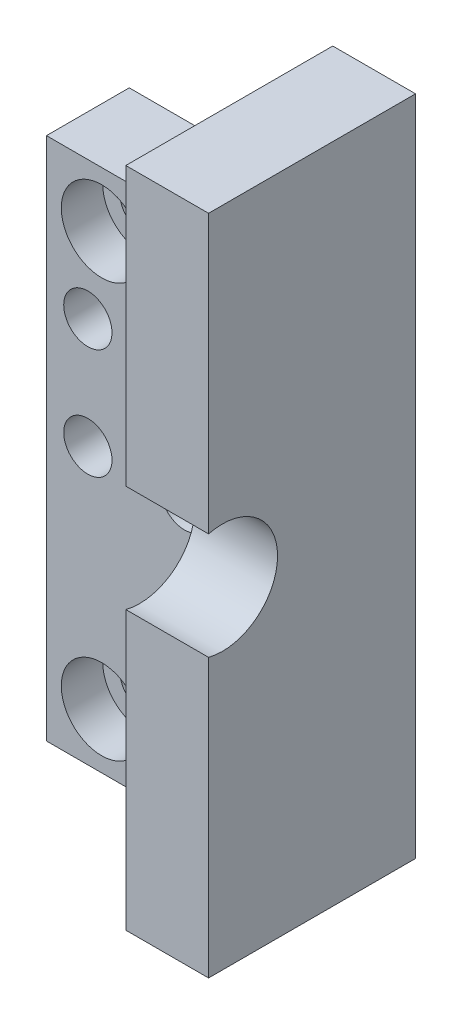
ISO-10303-21;
HEADER;
FILE_DESCRIPTION(('STEP AP214'),'2;1');
FILE_NAME('part.step','',(''),(''),'','','');
FILE_SCHEMA(('AUTOMOTIVE_DESIGN { 1 0 10303 214 1 1 1 1 }'));
ENDSEC;
DATA;
#1=APPLICATION_CONTEXT('core data for automotive mechanical design processes');
#2=APPLICATION_PROTOCOL_DEFINITION('international standard','automotive_design',2000,#1);
#3=PRODUCT_CONTEXT('',#1,'mechanical');
#4=PRODUCT('Part','Part','',(#3));
#5=PRODUCT_RELATED_PRODUCT_CATEGORY('part','',(#4));
#6=PRODUCT_DEFINITION_FORMATION('','',#4);
#7=PRODUCT_DEFINITION_CONTEXT('part definition',#1,'design');
#8=PRODUCT_DEFINITION('design','',#6,#7);
#9=PRODUCT_DEFINITION_SHAPE('','',#8);
#10=(LENGTH_UNIT() NAMED_UNIT(*) SI_UNIT(.MILLI.,.METRE.));
#11=(NAMED_UNIT(*) PLANE_ANGLE_UNIT() SI_UNIT($,.RADIAN.));
#12=(NAMED_UNIT(*) SI_UNIT($,.STERADIAN.) SOLID_ANGLE_UNIT());
#13=UNCERTAINTY_MEASURE_WITH_UNIT(LENGTH_MEASURE(1.E-05),#10,'distance_accuracy_value','');
#14=(GEOMETRIC_REPRESENTATION_CONTEXT(3) GLOBAL_UNCERTAINTY_ASSIGNED_CONTEXT((#13)) GLOBAL_UNIT_ASSIGNED_CONTEXT((#10,
#11,#12)) REPRESENTATION_CONTEXT('',''));
#15=CARTESIAN_POINT('',(0.,0.,0.));
#16=DIRECTION('',(0.,0.,1.));
#17=DIRECTION('',(1.,0.,0.));
#18=AXIS2_PLACEMENT_3D('',#15,#16,#17);
#19=CARTESIAN_POINT('',(0.,0.,0.));
#20=DIRECTION('',(0.,0.,-1.));
#21=DIRECTION('',(-1.,0.,0.));
#22=AXIS2_PLACEMENT_3D('',#19,#20,#21);
#23=PLANE('',#22);
#24=DIRECTION('',(0.,-1.,0.));
#25=VECTOR('',#24,1.);
#26=CARTESIAN_POINT('',(20.75,48.,0.));
#27=LINE('',#26,#25);
#28=CARTESIAN_POINT('',(20.75,38.,0.));
#29=VERTEX_POINT('',#28);
#30=CARTESIAN_POINT('',(20.75,0.,0.));
#31=VERTEX_POINT('',#30);
#32=EDGE_CURVE('E149',#29,#31,#27,.T.);
#33=ORIENTED_EDGE('',*,*,#32,.F.);
#34=DIRECTION('',(-1.,0.,0.));
#35=VECTOR('',#34,1.);
#36=CARTESIAN_POINT('',(0.,38.,0.));
#37=LINE('',#36,#35);
#38=CARTESIAN_POINT('',(35.5,38.,0.));
#39=VERTEX_POINT('',#38);
#40=EDGE_CURVE('E168',#39,#29,#37,.T.);
#41=ORIENTED_EDGE('',*,*,#40,.F.);
#42=DIRECTION('',(0.,1.,0.));
#43=VECTOR('',#42,1.);
#44=CARTESIAN_POINT('',(35.5,0.,0.));
#45=LINE('',#44,#43);
#46=CARTESIAN_POINT('',(35.5,48.,0.));
#47=VERTEX_POINT('',#46);
#48=EDGE_CURVE('E328',#39,#47,#45,.T.);
#49=ORIENTED_EDGE('',*,*,#48,.T.);
#50=DIRECTION('',(1.,0.,0.));
#51=VECTOR('',#50,1.);
#52=CARTESIAN_POINT('',(41.5,48.,0.));
#53=LINE('',#52,#51);
#54=CARTESIAN_POINT('',(41.5,48.,0.));
#55=VERTEX_POINT('',#54);
#56=EDGE_CURVE('E296',#47,#55,#53,.T.);
#57=ORIENTED_EDGE('',*,*,#56,.T.);
#58=DIRECTION('',(0.,-1.,0.));
#59=VECTOR('',#58,1.);
#60=CARTESIAN_POINT('',(41.5,0.,0.));
#61=LINE('',#60,#59);
#62=CARTESIAN_POINT('',(41.5,0.,0.));
#63=VERTEX_POINT('',#62);
#64=EDGE_CURVE('E167',#55,#63,#61,.T.);
#65=ORIENTED_EDGE('',*,*,#64,.T.);
#66=DIRECTION('',(1.,0.,0.));
#67=VECTOR('',#66,1.);
#68=CARTESIAN_POINT('',(0.,0.,0.));
#69=LINE('',#68,#67);
#70=EDGE_CURVE('E159',#31,#63,#69,.T.);
#71=ORIENTED_EDGE('',*,*,#70,.F.);
#72=EDGE_LOOP('',(#33,#41,#49,#57,#65,#71));
#73=FACE_BOUND('',#72,.T.);
#74=CARTESIAN_POINT('',(24.75,4.,0.));
#75=DIRECTION('',(0.,0.,-1.));
#76=DIRECTION('',(-1.,0.,0.));
#77=AXIS2_PLACEMENT_3D('',#74,#75,#76);
#78=CIRCLE('',#77,1.675);
#79=CARTESIAN_POINT('',(23.075,4.,0.));
#80=VERTEX_POINT('',#79);
#81=EDGE_CURVE('E289',#80,#80,#78,.T.);
#82=ORIENTED_EDGE('',*,*,#81,.F.);
#83=EDGE_LOOP('',(#82));
#84=FACE_BOUND('',#83,.T.);
#85=CARTESIAN_POINT('',(24.75,34.,0.));
#86=DIRECTION('',(0.,0.,-1.));
#87=DIRECTION('',(-1.,0.,0.));
#88=AXIS2_PLACEMENT_3D('',#85,#86,#87);
#89=CIRCLE('',#88,1.67500000000001);
#90=CARTESIAN_POINT('',(23.075,34.,0.));
#91=VERTEX_POINT('',#90);
#92=EDGE_CURVE('E292',#91,#91,#89,.T.);
#93=ORIENTED_EDGE('',*,*,#92,.F.);
#94=EDGE_LOOP('',(#93));
#95=FACE_BOUND('',#94,.T.);
#96=CARTESIAN_POINT('',(30.75,28.,0.));
#97=DIRECTION('',(0.,0.,-1.));
#98=DIRECTION('',(-1.,0.,0.));
#99=AXIS2_PLACEMENT_3D('',#96,#97,#98);
#100=CIRCLE('',#99,1.75);
#101=CARTESIAN_POINT('',(32.5,28.,0.));
#102=VERTEX_POINT('',#101);
#103=CARTESIAN_POINT('',(29.,28.,0.));
#104=VERTEX_POINT('',#103);
#105=EDGE_CURVE('E186',#102,#104,#100,.F.);
#106=ORIENTED_EDGE('',*,*,#105,.T.);
#107=DIRECTION('',(0.,-1.,0.));
#108=VECTOR('',#107,1.);
#109=CARTESIAN_POINT('',(29.,20.,0.));
#110=LINE('',#109,#108);
#111=CARTESIAN_POINT('',(29.,20.,0.));
#112=VERTEX_POINT('',#111);
#113=EDGE_CURVE('E333',#104,#112,#110,.T.);
#114=ORIENTED_EDGE('',*,*,#113,.T.);
#115=CARTESIAN_POINT('',(30.75,20.,0.));
#116=DIRECTION('',(0.,0.,-1.));
#117=DIRECTION('',(-1.,0.,0.));
#118=AXIS2_PLACEMENT_3D('',#115,#116,#117);
#119=CIRCLE('',#118,1.75);
#120=CARTESIAN_POINT('',(32.5,20.,0.));
#121=VERTEX_POINT('',#120);
#122=EDGE_CURVE('E193',#112,#121,#119,.F.);
#123=ORIENTED_EDGE('',*,*,#122,.T.);
#124=DIRECTION('',(0.,1.,0.));
#125=VECTOR('',#124,1.);
#126=CARTESIAN_POINT('',(32.5,20.,0.));
#127=LINE('',#126,#125);
#128=EDGE_CURVE('E220',#121,#102,#127,.T.);
#129=ORIENTED_EDGE('',*,*,#128,.T.);
#130=EDGE_LOOP('',(#106,#114,#123,#129));
#131=FACE_BOUND('',#130,.T.);
#132=CARTESIAN_POINT('',(23.75,28.,0.));
#133=DIRECTION('',(0.,0.,-1.));
#134=DIRECTION('',(-1.,0.,0.));
#135=AXIS2_PLACEMENT_3D('',#132,#133,#134);
#136=CIRCLE('',#135,1.75);
#137=CARTESIAN_POINT('',(25.5,28.,0.));
#138=VERTEX_POINT('',#137);
#139=CARTESIAN_POINT('',(22.,28.,0.));
#140=VERTEX_POINT('',#139);
#141=EDGE_CURVE('E196',#138,#140,#136,.F.);
#142=ORIENTED_EDGE('',*,*,#141,.T.);
#143=DIRECTION('',(0.,-1.,0.));
#144=VECTOR('',#143,1.);
#145=CARTESIAN_POINT('',(22.,28.,0.));
#146=LINE('',#145,#144);
#147=CARTESIAN_POINT('',(22.,20.,0.));
#148=VERTEX_POINT('',#147);
#149=EDGE_CURVE('E224',#140,#148,#146,.T.);
#150=ORIENTED_EDGE('',*,*,#149,.T.);
#151=CARTESIAN_POINT('',(23.75,20.,0.));
#152=DIRECTION('',(0.,0.,-1.));
#153=DIRECTION('',(-1.,0.,0.));
#154=AXIS2_PLACEMENT_3D('',#151,#152,#153);
#155=CIRCLE('',#154,1.75);
#156=CARTESIAN_POINT('',(25.5,20.,0.));
#157=VERTEX_POINT('',#156);
#158=EDGE_CURVE('E189',#148,#157,#155,.F.);
#159=ORIENTED_EDGE('',*,*,#158,.T.);
#160=DIRECTION('',(0.,1.,0.));
#161=VECTOR('',#160,1.);
#162=CARTESIAN_POINT('',(25.5,28.,0.));
#163=LINE('',#162,#161);
#164=EDGE_CURVE('E228',#157,#138,#163,.T.);
#165=ORIENTED_EDGE('',*,*,#164,.T.);
#166=EDGE_LOOP('',(#142,#150,#159,#165));
#167=FACE_BOUND('',#166,.T.);
#168=ADVANCED_FACE('F32',(#73,#84,#95,#131,#167),#23,.T.);
#169=CARTESIAN_POINT('',(0.,0.,6.));
#170=DIRECTION('',(0.,0.,-1.));
#171=DIRECTION('',(-1.,0.,0.));
#172=AXIS2_PLACEMENT_3D('',#169,#170,#171);
#173=PLANE('',#172);
#174=CARTESIAN_POINT('',(24.75,4.,6.));
#175=DIRECTION('',(0.,0.,-1.));
#176=DIRECTION('',(-1.,0.,0.));
#177=AXIS2_PLACEMENT_3D('',#174,#175,#176);
#178=CIRCLE('',#177,2.925);
#179=CARTESIAN_POINT('',(21.825,4.,6.));
#180=VERTEX_POINT('',#179);
#181=EDGE_CURVE('E199',#180,#180,#178,.T.);
#182=ORIENTED_EDGE('',*,*,#181,.T.);
#183=EDGE_LOOP('',(#182));
#184=FACE_BOUND('',#183,.T.);
#185=CARTESIAN_POINT('',(24.75,34.,6.));
#186=DIRECTION('',(0.,0.,-1.));
#187=DIRECTION('',(-1.,0.,0.));
#188=AXIS2_PLACEMENT_3D('',#185,#186,#187);
#189=CIRCLE('',#188,2.925);
#190=CARTESIAN_POINT('',(21.825,34.,6.));
#191=VERTEX_POINT('',#190);
#192=EDGE_CURVE('E256',#191,#191,#189,.T.);
#193=ORIENTED_EDGE('',*,*,#192,.T.);
#194=EDGE_LOOP('',(#193));
#195=FACE_BOUND('',#194,.T.);
#196=CARTESIAN_POINT('',(30.75,28.,6.));
#197=DIRECTION('',(0.,0.,-1.));
#198=DIRECTION('',(-1.,0.,0.));
#199=AXIS2_PLACEMENT_3D('',#196,#197,#198);
#200=CIRCLE('',#199,1.75);
#201=CARTESIAN_POINT('',(29.,28.,6.));
#202=VERTEX_POINT('',#201);
#203=EDGE_CURVE('E190',#202,#202,#200,.T.);
#204=ORIENTED_EDGE('',*,*,#203,.T.);
#205=EDGE_LOOP('',(#204));
#206=FACE_BOUND('',#205,.T.);
#207=CARTESIAN_POINT('',(23.75,20.,6.));
#208=DIRECTION('',(0.,0.,-1.));
#209=DIRECTION('',(1.,0.,0.));
#210=AXIS2_PLACEMENT_3D('',#207,#208,#209);
#211=CIRCLE('',#210,1.75);
#212=CARTESIAN_POINT('',(25.5,20.,6.));
#213=VERTEX_POINT('',#212);
#214=EDGE_CURVE('E243',#213,#213,#211,.T.);
#215=ORIENTED_EDGE('',*,*,#214,.T.);
#216=EDGE_LOOP('',(#215));
#217=FACE_BOUND('',#216,.T.);
#218=CARTESIAN_POINT('',(30.75,20.,6.));
#219=DIRECTION('',(0.,0.,-1.));
#220=DIRECTION('',(1.,0.,0.));
#221=AXIS2_PLACEMENT_3D('',#218,#219,#220);
#222=CIRCLE('',#221,1.75);
#223=CARTESIAN_POINT('',(32.5,20.,6.));
#224=VERTEX_POINT('',#223);
#225=EDGE_CURVE('E246',#224,#224,#222,.T.);
#226=ORIENTED_EDGE('',*,*,#225,.T.);
#227=EDGE_LOOP('',(#226));
#228=FACE_BOUND('',#227,.T.);
#229=CARTESIAN_POINT('',(23.75,28.,6.));
#230=DIRECTION('',(0.,0.,-1.));
#231=DIRECTION('',(-1.,0.,0.));
#232=AXIS2_PLACEMENT_3D('',#229,#230,#231);
#233=CIRCLE('',#232,1.75);
#234=CARTESIAN_POINT('',(22.,28.,6.));
#235=VERTEX_POINT('',#234);
#236=EDGE_CURVE('E247',#235,#235,#233,.T.);
#237=ORIENTED_EDGE('',*,*,#236,.T.);
#238=EDGE_LOOP('',(#237));
#239=FACE_BOUND('',#238,.T.);
#240=DIRECTION('',(1.,0.,0.));
#241=VECTOR('',#240,1.);
#242=CARTESIAN_POINT('',(20.75,38.,6.));
#243=LINE('',#242,#241);
#244=CARTESIAN_POINT('',(20.75,38.,6.));
#245=VERTEX_POINT('',#244);
#246=CARTESIAN_POINT('',(35.5,38.,6.));
#247=VERTEX_POINT('',#246);
#248=EDGE_CURVE('E53',#245,#247,#243,.T.);
#249=ORIENTED_EDGE('',*,*,#248,.F.);
#250=DIRECTION('',(0.,-1.,0.));
#251=VECTOR('',#250,1.);
#252=CARTESIAN_POINT('',(20.75,0.,6.));
#253=LINE('',#252,#251);
#254=CARTESIAN_POINT('',(20.75,0.,6.));
#255=VERTEX_POINT('',#254);
#256=EDGE_CURVE('E47',#245,#255,#253,.T.);
#257=ORIENTED_EDGE('',*,*,#256,.T.);
#258=DIRECTION('',(1.,0.,0.));
#259=VECTOR('',#258,1.);
#260=CARTESIAN_POINT('',(0.,0.,6.));
#261=LINE('',#260,#259);
#262=CARTESIAN_POINT('',(35.5,0.,6.));
#263=VERTEX_POINT('',#262);
#264=EDGE_CURVE('E162',#255,#263,#261,.T.);
#265=ORIENTED_EDGE('',*,*,#264,.T.);
#266=DIRECTION('',(0.,-1.,0.));
#267=VECTOR('',#266,1.);
#268=CARTESIAN_POINT('',(35.5,0.,6.));
#269=LINE('',#268,#267);
#270=EDGE_CURVE('E284',#247,#263,#269,.T.);
#271=ORIENTED_EDGE('',*,*,#270,.F.);
#272=EDGE_LOOP('',(#249,#257,#265,#271));
#273=FACE_BOUND('',#272,.T.);
#274=ADVANCED_FACE('F326',(#184,#195,#206,#217,#228,#239,#273),#173,.F.);
#275=CARTESIAN_POINT('',(41.5,48.,6.));
#276=DIRECTION('',(0.,1.,0.));
#277=DIRECTION('',(0.,0.,1.));
#278=AXIS2_PLACEMENT_3D('',#275,#276,#277);
#279=PLANE('',#278);
#280=ORIENTED_EDGE('',*,*,#56,.F.);
#281=DIRECTION('',(0.,0.,-1.));
#282=VECTOR('',#281,1.);
#283=CARTESIAN_POINT('',(35.5,48.,0.));
#284=LINE('',#283,#282);
#285=CARTESIAN_POINT('',(35.5,48.,15.));
#286=VERTEX_POINT('',#285);
#287=EDGE_CURVE('E269',#286,#47,#284,.T.);
#288=ORIENTED_EDGE('',*,*,#287,.F.);
#289=DIRECTION('',(1.,0.,0.));
#290=VECTOR('',#289,1.);
#291=CARTESIAN_POINT('',(35.5,48.,15.));
#292=LINE('',#291,#290);
#293=CARTESIAN_POINT('',(41.5,48.,15.));
#294=VERTEX_POINT('',#293);
#295=EDGE_CURVE('E278',#286,#294,#292,.T.);
#296=ORIENTED_EDGE('',*,*,#295,.T.);
#297=DIRECTION('',(0.,0.,-1.));
#298=VECTOR('',#297,1.);
#299=CARTESIAN_POINT('',(41.5,48.,6.));
#300=LINE('',#299,#298);
#301=EDGE_CURVE('E300',#294,#55,#300,.T.);
#302=ORIENTED_EDGE('',*,*,#301,.T.);
#303=EDGE_LOOP('',(#280,#288,#296,#302));
#304=FACE_BOUND('',#303,.T.);
#305=ADVANCED_FACE('F306',(#304),#279,.T.);
#306=CARTESIAN_POINT('',(30.75,28.,-4.));
#307=DIRECTION('',(0.,0.,1.));
#308=DIRECTION('',(1.,0.,0.));
#309=AXIS2_PLACEMENT_3D('',#306,#307,#308);
#310=CYLINDRICAL_SURFACE('',#309,1.75);
#311=ORIENTED_EDGE('',*,*,#203,.F.);
#312=EDGE_LOOP('',(#311));
#313=FACE_BOUND('',#312,.T.);
#314=ORIENTED_EDGE('',*,*,#105,.F.);
#315=DIRECTION('',(0.,0.,-1.));
#316=VECTOR('',#315,1.);
#317=CARTESIAN_POINT('',(32.5,28.,2.5));
#318=LINE('',#317,#316);
#319=CARTESIAN_POINT('',(32.5,28.,2.5));
#320=VERTEX_POINT('',#319);
#321=EDGE_CURVE('E230',#320,#102,#318,.T.);
#322=ORIENTED_EDGE('',*,*,#321,.F.);
#323=CARTESIAN_POINT('',(30.75,28.,2.5));
#324=DIRECTION('',(0.,0.,1.));
#325=DIRECTION('',(1.,0.,0.));
#326=AXIS2_PLACEMENT_3D('',#323,#324,#325);
#327=CIRCLE('',#326,1.75);
#328=CARTESIAN_POINT('',(29.,28.,2.5));
#329=VERTEX_POINT('',#328);
#330=EDGE_CURVE('E240',#329,#320,#327,.T.);
#331=ORIENTED_EDGE('',*,*,#330,.F.);
#332=DIRECTION('',(0.,0.,-1.));
#333=VECTOR('',#332,1.);
#334=CARTESIAN_POINT('',(29.,28.,2.5));
#335=LINE('',#334,#333);
#336=EDGE_CURVE('E219',#329,#104,#335,.T.);
#337=ORIENTED_EDGE('',*,*,#336,.T.);
#338=EDGE_LOOP('',(#314,#322,#331,#337));
#339=FACE_BOUND('',#338,.T.);
#340=ADVANCED_FACE('F358',(#313,#339),#310,.F.);
#341=CARTESIAN_POINT('',(23.75,20.,-4.));
#342=DIRECTION('',(0.,0.,1.));
#343=DIRECTION('',(1.,0.,0.));
#344=AXIS2_PLACEMENT_3D('',#341,#342,#343);
#345=CYLINDRICAL_SURFACE('',#344,1.75);
#346=ORIENTED_EDGE('',*,*,#214,.F.);
#347=EDGE_LOOP('',(#346));
#348=FACE_BOUND('',#347,.T.);
#349=ORIENTED_EDGE('',*,*,#158,.F.);
#350=DIRECTION('',(0.,0.,-1.));
#351=VECTOR('',#350,1.);
#352=CARTESIAN_POINT('',(22.,20.,2.5));
#353=LINE('',#352,#351);
#354=CARTESIAN_POINT('',(22.,20.,2.5));
#355=VERTEX_POINT('',#354);
#356=EDGE_CURVE('E241',#355,#148,#353,.T.);
#357=ORIENTED_EDGE('',*,*,#356,.F.);
#358=CARTESIAN_POINT('',(23.75,20.,2.5));
#359=DIRECTION('',(0.,0.,-1.));
#360=DIRECTION('',(-1.,0.,0.));
#361=AXIS2_PLACEMENT_3D('',#358,#359,#360);
#362=CIRCLE('',#361,1.75);
#363=CARTESIAN_POINT('',(25.5,20.,2.5));
#364=VERTEX_POINT('',#363);
#365=EDGE_CURVE('E237',#355,#364,#362,.T.);
#366=ORIENTED_EDGE('',*,*,#365,.T.);
#367=DIRECTION('',(0.,0.,-1.));
#368=VECTOR('',#367,1.);
#369=CARTESIAN_POINT('',(25.5,20.,2.5));
#370=LINE('',#369,#368);
#371=EDGE_CURVE('E344',#364,#157,#370,.T.);
#372=ORIENTED_EDGE('',*,*,#371,.T.);
#373=EDGE_LOOP('',(#349,#357,#366,#372));
#374=FACE_BOUND('',#373,.T.);
#375=ADVANCED_FACE('F421',(#348,#374),#345,.F.);
#376=CARTESIAN_POINT('',(30.75,20.,-4.));
#377=DIRECTION('',(0.,0.,1.));
#378=DIRECTION('',(1.,0.,0.));
#379=AXIS2_PLACEMENT_3D('',#376,#377,#378);
#380=CYLINDRICAL_SURFACE('',#379,1.75);
#381=ORIENTED_EDGE('',*,*,#225,.F.);
#382=EDGE_LOOP('',(#381));
#383=FACE_BOUND('',#382,.T.);
#384=ORIENTED_EDGE('',*,*,#122,.F.);
#385=DIRECTION('',(0.,0.,-1.));
#386=VECTOR('',#385,1.);
#387=CARTESIAN_POINT('',(29.,20.,2.5));
#388=LINE('',#387,#386);
#389=CARTESIAN_POINT('',(29.,20.,2.5));
#390=VERTEX_POINT('',#389);
#391=EDGE_CURVE('E216',#390,#112,#388,.T.);
#392=ORIENTED_EDGE('',*,*,#391,.F.);
#393=CARTESIAN_POINT('',(30.75,20.,2.5));
#394=DIRECTION('',(0.,0.,1.));
#395=DIRECTION('',(1.,0.,0.));
#396=AXIS2_PLACEMENT_3D('',#393,#394,#395);
#397=CIRCLE('',#396,1.75);
#398=CARTESIAN_POINT('',(32.5,20.,2.5));
#399=VERTEX_POINT('',#398);
#400=EDGE_CURVE('E40',#399,#390,#397,.T.);
#401=ORIENTED_EDGE('',*,*,#400,.F.);
#402=DIRECTION('',(0.,0.,-1.));
#403=VECTOR('',#402,1.);
#404=CARTESIAN_POINT('',(32.5,20.,2.5));
#405=LINE('',#404,#403);
#406=EDGE_CURVE('E225',#399,#121,#405,.T.);
#407=ORIENTED_EDGE('',*,*,#406,.T.);
#408=EDGE_LOOP('',(#384,#392,#401,#407));
#409=FACE_BOUND('',#408,.T.);
#410=ADVANCED_FACE('F223',(#383,#409),#380,.F.);
#411=CARTESIAN_POINT('',(23.75,28.,-4.));
#412=DIRECTION('',(0.,0.,1.));
#413=DIRECTION('',(1.,0.,0.));
#414=AXIS2_PLACEMENT_3D('',#411,#412,#413);
#415=CYLINDRICAL_SURFACE('',#414,1.75);
#416=ORIENTED_EDGE('',*,*,#236,.F.);
#417=EDGE_LOOP('',(#416));
#418=FACE_BOUND('',#417,.T.);
#419=ORIENTED_EDGE('',*,*,#141,.F.);
#420=DIRECTION('',(0.,0.,-1.));
#421=VECTOR('',#420,1.);
#422=CARTESIAN_POINT('',(25.5,28.,2.5));
#423=LINE('',#422,#421);
#424=CARTESIAN_POINT('',(25.5,28.,2.5));
#425=VERTEX_POINT('',#424);
#426=EDGE_CURVE('E347',#425,#138,#423,.T.);
#427=ORIENTED_EDGE('',*,*,#426,.F.);
#428=CARTESIAN_POINT('',(23.75,28.,2.5));
#429=DIRECTION('',(0.,0.,-1.));
#430=DIRECTION('',(-1.,0.,0.));
#431=AXIS2_PLACEMENT_3D('',#428,#429,#430);
#432=CIRCLE('',#431,1.75);
#433=CARTESIAN_POINT('',(22.,28.,2.5));
#434=VERTEX_POINT('',#433);
#435=EDGE_CURVE('E177',#425,#434,#432,.T.);
#436=ORIENTED_EDGE('',*,*,#435,.T.);
#437=DIRECTION('',(0.,0.,-1.));
#438=VECTOR('',#437,1.);
#439=CARTESIAN_POINT('',(22.,28.,2.5));
#440=LINE('',#439,#438);
#441=EDGE_CURVE('E339',#434,#140,#440,.T.);
#442=ORIENTED_EDGE('',*,*,#441,.T.);
#443=EDGE_LOOP('',(#419,#427,#436,#442));
#444=FACE_BOUND('',#443,.T.);
#445=ADVANCED_FACE('F387',(#418,#444),#415,.F.);
#446=CARTESIAN_POINT('',(24.75,34.,6.));
#447=DIRECTION('',(0.,0.,-1.));
#448=DIRECTION('',(-1.,0.,0.));
#449=AXIS2_PLACEMENT_3D('',#446,#447,#448);
#450=CYLINDRICAL_SURFACE('',#449,1.67500000000001);
#451=ORIENTED_EDGE('',*,*,#92,.T.);
#452=EDGE_LOOP('',(#451));
#453=FACE_BOUND('',#452,.T.);
#454=CARTESIAN_POINT('',(24.75,34.,3.));
#455=DIRECTION('',(0.,0.,1.));
#456=DIRECTION('',(1.,0.,0.));
#457=AXIS2_PLACEMENT_3D('',#454,#455,#456);
#458=CIRCLE('',#457,1.67500000000001);
#459=CARTESIAN_POINT('',(26.425,34.,3.));
#460=VERTEX_POINT('',#459);
#461=EDGE_CURVE('E181',#460,#460,#458,.F.);
#462=ORIENTED_EDGE('',*,*,#461,.F.);
#463=EDGE_LOOP('',(#462));
#464=FACE_BOUND('',#463,.T.);
#465=ADVANCED_FACE('F383',(#453,#464),#450,.F.);
#466=CARTESIAN_POINT('',(24.75,4.,6.));
#467=DIRECTION('',(0.,0.,-1.));
#468=DIRECTION('',(-1.,0.,0.));
#469=AXIS2_PLACEMENT_3D('',#466,#467,#468);
#470=CYLINDRICAL_SURFACE('',#469,1.675);
#471=ORIENTED_EDGE('',*,*,#81,.T.);
#472=EDGE_LOOP('',(#471));
#473=FACE_BOUND('',#472,.T.);
#474=CARTESIAN_POINT('',(24.75,4.,3.));
#475=DIRECTION('',(0.,0.,1.));
#476=DIRECTION('',(1.,0.,0.));
#477=AXIS2_PLACEMENT_3D('',#474,#475,#476);
#478=CIRCLE('',#477,1.675);
#479=CARTESIAN_POINT('',(26.425,4.,3.));
#480=VERTEX_POINT('',#479);
#481=EDGE_CURVE('E178',#480,#480,#478,.F.);
#482=ORIENTED_EDGE('',*,*,#481,.F.);
#483=EDGE_LOOP('',(#482));
#484=FACE_BOUND('',#483,.T.);
#485=ADVANCED_FACE('F386',(#473,#484),#470,.F.);
#486=CARTESIAN_POINT('',(35.5,48.,15.));
#487=DIRECTION('',(0.,0.,-1.));
#488=DIRECTION('',(0.,1.,0.));
#489=AXIS2_PLACEMENT_3D('',#486,#487,#488);
#490=PLANE('',#489);
#491=DIRECTION('',(1.,0.,0.));
#492=VECTOR('',#491,1.);
#493=CARTESIAN_POINT('',(35.5,27.8729833462074,15.));
#494=LINE('',#493,#492);
#495=CARTESIAN_POINT('',(41.5,27.8729833462074,15.));
#496=VERTEX_POINT('',#495);
#497=CARTESIAN_POINT('',(35.5,27.8729833462074,15.));
#498=VERTEX_POINT('',#497);
#499=EDGE_CURVE('E175',#496,#498,#494,.F.);
#500=ORIENTED_EDGE('',*,*,#499,.F.);
#501=DIRECTION('',(0.,1.,0.));
#502=VECTOR('',#501,1.);
#503=CARTESIAN_POINT('',(41.5,48.,15.));
#504=LINE('',#503,#502);
#505=EDGE_CURVE('E266',#496,#294,#504,.T.);
#506=ORIENTED_EDGE('',*,*,#505,.T.);
#507=ORIENTED_EDGE('',*,*,#295,.F.);
#508=DIRECTION('',(0.,1.,0.));
#509=VECTOR('',#508,1.);
#510=CARTESIAN_POINT('',(35.5,48.,15.));
#511=LINE('',#510,#509);
#512=EDGE_CURVE('E271',#498,#286,#511,.T.);
#513=ORIENTED_EDGE('',*,*,#512,.F.);
#514=EDGE_LOOP('',(#500,#506,#507,#513));
#515=FACE_BOUND('',#514,.T.);
#516=ADVANCED_FACE('F391',(#515),#490,.F.);
#517=DIRECTION('',(1.,0.,0.));
#518=VECTOR('',#517,1.);
#519=CARTESIAN_POINT('',(35.5,20.1270166537926,15.));
#520=LINE('',#519,#518);
#521=CARTESIAN_POINT('',(35.5,20.1270166537926,15.));
#522=VERTEX_POINT('',#521);
#523=CARTESIAN_POINT('',(41.5,20.1270166537926,15.));
#524=VERTEX_POINT('',#523);
#525=EDGE_CURVE('E170',#522,#524,#520,.T.);
#526=ORIENTED_EDGE('',*,*,#525,.F.);
#527=CARTESIAN_POINT('',(35.5,0.,15.));
#528=VERTEX_POINT('',#527);
#529=EDGE_CURVE('E273',#528,#522,#511,.T.);
#530=ORIENTED_EDGE('',*,*,#529,.F.);
#531=DIRECTION('',(1.,0.,0.));
#532=VECTOR('',#531,1.);
#533=CARTESIAN_POINT('',(35.5,0.,15.));
#534=LINE('',#533,#532);
#535=CARTESIAN_POINT('',(41.5,0.,15.));
#536=VERTEX_POINT('',#535);
#537=EDGE_CURVE('E281',#528,#536,#534,.T.);
#538=ORIENTED_EDGE('',*,*,#537,.T.);
#539=EDGE_CURVE('E272',#536,#524,#504,.T.);
#540=ORIENTED_EDGE('',*,*,#539,.T.);
#541=EDGE_LOOP('',(#526,#530,#538,#540));
#542=FACE_BOUND('',#541,.T.);
#543=ADVANCED_FACE('F317',(#542),#490,.F.);
#544=CARTESIAN_POINT('',(0.,0.,6.));
#545=DIRECTION('',(0.,1.,0.));
#546=DIRECTION('',(0.,0.,1.));
#547=AXIS2_PLACEMENT_3D('',#544,#545,#546);
#548=PLANE('',#547);
#549=ORIENTED_EDGE('',*,*,#264,.F.);
#550=DIRECTION('',(0.,0.,1.));
#551=VECTOR('',#550,1.);
#552=CARTESIAN_POINT('',(20.75,0.,15.));
#553=LINE('',#552,#551);
#554=EDGE_CURVE('E152',#31,#255,#553,.T.);
#555=ORIENTED_EDGE('',*,*,#554,.F.);
#556=ORIENTED_EDGE('',*,*,#70,.T.);
#557=DIRECTION('',(0.,0.,-1.));
#558=VECTOR('',#557,1.);
#559=CARTESIAN_POINT('',(41.5,0.,6.));
#560=LINE('',#559,#558);
#561=EDGE_CURVE('E298',#536,#63,#560,.T.);
#562=ORIENTED_EDGE('',*,*,#561,.F.);
#563=ORIENTED_EDGE('',*,*,#537,.F.);
#564=DIRECTION('',(0.,0.,1.));
#565=VECTOR('',#564,1.);
#566=CARTESIAN_POINT('',(35.5,0.,0.));
#567=LINE('',#566,#565);
#568=EDGE_CURVE('E276',#263,#528,#567,.T.);
#569=ORIENTED_EDGE('',*,*,#568,.F.);
#570=EDGE_LOOP('',(#549,#555,#556,#562,#563,#569));
#571=FACE_BOUND('',#570,.T.);
#572=ADVANCED_FACE('F34',(#571),#548,.F.);
#573=CARTESIAN_POINT('',(20.75,38.,-10.));
#574=DIRECTION('',(0.,-1.,0.));
#575=DIRECTION('',(0.,0.,-1.));
#576=AXIS2_PLACEMENT_3D('',#573,#574,#575);
#577=PLANE('',#576);
#578=ORIENTED_EDGE('',*,*,#40,.T.);
#579=DIRECTION('',(0.,0.,1.));
#580=VECTOR('',#579,1.);
#581=CARTESIAN_POINT('',(20.75,38.,-10.));
#582=LINE('',#581,#580);
#583=EDGE_CURVE('E11',#29,#245,#582,.T.);
#584=ORIENTED_EDGE('',*,*,#583,.T.);
#585=ORIENTED_EDGE('',*,*,#248,.T.);
#586=DIRECTION('',(0.,0.,1.));
#587=VECTOR('',#586,1.);
#588=CARTESIAN_POINT('',(35.5,38.,-10.));
#589=LINE('',#588,#587);
#590=EDGE_CURVE('E324',#39,#247,#589,.T.);
#591=ORIENTED_EDGE('',*,*,#590,.F.);
#592=EDGE_LOOP('',(#578,#584,#585,#591));
#593=FACE_BOUND('',#592,.T.);
#594=ADVANCED_FACE('F376',(#593),#577,.F.);
#595=CARTESIAN_POINT('',(41.5,0.,6.));
#596=DIRECTION('',(1.,0.,0.));
#597=DIRECTION('',(0.,0.,-1.));
#598=AXIS2_PLACEMENT_3D('',#595,#596,#597);
#599=PLANE('',#598);
#600=ORIENTED_EDGE('',*,*,#505,.F.);
#601=CARTESIAN_POINT('',(41.5,24.,14.));
#602=DIRECTION('',(-1.,0.,0.));
#603=DIRECTION('',(0.,0.,1.));
#604=AXIS2_PLACEMENT_3D('',#601,#602,#603);
#605=CIRCLE('',#604,4.);
#606=EDGE_CURVE('E185',#496,#524,#605,.T.);
#607=ORIENTED_EDGE('',*,*,#606,.T.);
#608=ORIENTED_EDGE('',*,*,#539,.F.);
#609=ORIENTED_EDGE('',*,*,#561,.T.);
#610=ORIENTED_EDGE('',*,*,#64,.F.);
#611=ORIENTED_EDGE('',*,*,#301,.F.);
#612=EDGE_LOOP('',(#600,#607,#608,#609,#610,#611));
#613=FACE_BOUND('',#612,.T.);
#614=ADVANCED_FACE('F311',(#613),#599,.T.);
#615=CARTESIAN_POINT('',(35.5,0.,0.));
#616=DIRECTION('',(1.,0.,0.));
#617=DIRECTION('',(0.,0.,1.));
#618=AXIS2_PLACEMENT_3D('',#615,#616,#617);
#619=PLANE('',#618);
#620=CARTESIAN_POINT('',(35.5,24.,14.));
#621=DIRECTION('',(-1.,0.,0.));
#622=DIRECTION('',(0.,0.,1.));
#623=AXIS2_PLACEMENT_3D('',#620,#621,#622);
#624=CIRCLE('',#623,4.);
#625=EDGE_CURVE('E264',#498,#522,#624,.T.);
#626=ORIENTED_EDGE('',*,*,#625,.F.);
#627=ORIENTED_EDGE('',*,*,#512,.T.);
#628=ORIENTED_EDGE('',*,*,#287,.T.);
#629=ORIENTED_EDGE('',*,*,#48,.F.);
#630=ORIENTED_EDGE('',*,*,#590,.T.);
#631=ORIENTED_EDGE('',*,*,#270,.T.);
#632=ORIENTED_EDGE('',*,*,#568,.T.);
#633=ORIENTED_EDGE('',*,*,#529,.T.);
#634=EDGE_LOOP('',(#626,#627,#628,#629,#630,#631,#632,#633));
#635=FACE_BOUND('',#634,.T.);
#636=ADVANCED_FACE('F320',(#635),#619,.F.);
#637=CARTESIAN_POINT('',(35.5,24.,14.));
#638=DIRECTION('',(1.,0.,0.));
#639=DIRECTION('',(0.,0.,-1.));
#640=AXIS2_PLACEMENT_3D('',#637,#638,#639);
#641=CYLINDRICAL_SURFACE('',#640,4.);
#642=ORIENTED_EDGE('',*,*,#499,.T.);
#643=ORIENTED_EDGE('',*,*,#625,.T.);
#644=ORIENTED_EDGE('',*,*,#525,.T.);
#645=ORIENTED_EDGE('',*,*,#606,.F.);
#646=EDGE_LOOP('',(#642,#643,#644,#645));
#647=FACE_BOUND('',#646,.T.);
#648=ADVANCED_FACE('F398',(#647),#641,.F.);
#649=CARTESIAN_POINT('',(24.75,4.,3.));
#650=DIRECTION('',(0.,0.,1.));
#651=DIRECTION('',(-1.,0.,0.));
#652=AXIS2_PLACEMENT_3D('',#649,#650,#651);
#653=PLANE('',#652);
#654=CARTESIAN_POINT('',(24.75,4.,3.));
#655=DIRECTION('',(0.,0.,-1.));
#656=DIRECTION('',(-1.,0.,0.));
#657=AXIS2_PLACEMENT_3D('',#654,#655,#656);
#658=CIRCLE('',#657,2.925);
#659=CARTESIAN_POINT('',(21.825,4.,3.));
#660=VERTEX_POINT('',#659);
#661=EDGE_CURVE('E259',#660,#660,#658,.T.);
#662=ORIENTED_EDGE('',*,*,#661,.F.);
#663=EDGE_LOOP('',(#662));
#664=FACE_BOUND('',#663,.T.);
#665=ORIENTED_EDGE('',*,*,#481,.T.);
#666=EDGE_LOOP('',(#665));
#667=FACE_BOUND('',#666,.T.);
#668=ADVANCED_FACE('F401',(#664,#667),#653,.T.);
#669=CARTESIAN_POINT('',(24.75,4.,3.));
#670=DIRECTION('',(0.,0.,1.));
#671=DIRECTION('',(1.,0.,0.));
#672=AXIS2_PLACEMENT_3D('',#669,#670,#671);
#673=CYLINDRICAL_SURFACE('',#672,2.925);
#674=ORIENTED_EDGE('',*,*,#661,.T.);
#675=EDGE_LOOP('',(#674));
#676=FACE_BOUND('',#675,.T.);
#677=ORIENTED_EDGE('',*,*,#181,.F.);
#678=EDGE_LOOP('',(#677));
#679=FACE_BOUND('',#678,.T.);
#680=ADVANCED_FACE('F403',(#676,#679),#673,.F.);
#681=CARTESIAN_POINT('',(24.75,34.,3.));
#682=DIRECTION('',(0.,0.,1.));
#683=DIRECTION('',(-1.,0.,0.));
#684=AXIS2_PLACEMENT_3D('',#681,#682,#683);
#685=PLANE('',#684);
#686=CARTESIAN_POINT('',(24.75,34.,3.));
#687=DIRECTION('',(0.,0.,-1.));
#688=DIRECTION('',(-1.,0.,0.));
#689=AXIS2_PLACEMENT_3D('',#686,#687,#688);
#690=CIRCLE('',#689,2.925);
#691=CARTESIAN_POINT('',(21.825,34.,3.));
#692=VERTEX_POINT('',#691);
#693=EDGE_CURVE('E182',#692,#692,#690,.T.);
#694=ORIENTED_EDGE('',*,*,#693,.F.);
#695=EDGE_LOOP('',(#694));
#696=FACE_BOUND('',#695,.T.);
#697=ORIENTED_EDGE('',*,*,#461,.T.);
#698=EDGE_LOOP('',(#697));
#699=FACE_BOUND('',#698,.T.);
#700=ADVANCED_FACE('F406',(#696,#699),#685,.T.);
#701=CARTESIAN_POINT('',(24.75,34.,3.));
#702=DIRECTION('',(0.,0.,1.));
#703=DIRECTION('',(1.,0.,0.));
#704=AXIS2_PLACEMENT_3D('',#701,#702,#703);
#705=CYLINDRICAL_SURFACE('',#704,2.925);
#706=ORIENTED_EDGE('',*,*,#693,.T.);
#707=EDGE_LOOP('',(#706));
#708=FACE_BOUND('',#707,.T.);
#709=ORIENTED_EDGE('',*,*,#192,.F.);
#710=EDGE_LOOP('',(#709));
#711=FACE_BOUND('',#710,.T.);
#712=ADVANCED_FACE('F411',(#708,#711),#705,.F.);
#713=CARTESIAN_POINT('',(22.,28.,2.5));
#714=DIRECTION('',(1.,0.,0.));
#715=DIRECTION('',(0.,0.,-1.));
#716=AXIS2_PLACEMENT_3D('',#713,#714,#715);
#717=PLANE('',#716);
#718=ORIENTED_EDGE('',*,*,#149,.F.);
#719=ORIENTED_EDGE('',*,*,#441,.F.);
#720=DIRECTION('',(0.,-1.,0.));
#721=VECTOR('',#720,1.);
#722=CARTESIAN_POINT('',(22.,28.,2.5));
#723=LINE('',#722,#721);
#724=EDGE_CURVE('E334',#434,#355,#723,.T.);
#725=ORIENTED_EDGE('',*,*,#724,.T.);
#726=ORIENTED_EDGE('',*,*,#356,.T.);
#727=EDGE_LOOP('',(#718,#719,#725,#726));
#728=FACE_BOUND('',#727,.T.);
#729=ADVANCED_FACE('F414',(#728),#717,.T.);
#730=CARTESIAN_POINT('',(25.5,28.,2.5));
#731=DIRECTION('',(-1.,0.,0.));
#732=DIRECTION('',(0.,0.,1.));
#733=AXIS2_PLACEMENT_3D('',#730,#731,#732);
#734=PLANE('',#733);
#735=ORIENTED_EDGE('',*,*,#164,.F.);
#736=ORIENTED_EDGE('',*,*,#371,.F.);
#737=DIRECTION('',(0.,1.,0.));
#738=VECTOR('',#737,1.);
#739=CARTESIAN_POINT('',(25.5,28.,2.5));
#740=LINE('',#739,#738);
#741=EDGE_CURVE('E337',#364,#425,#740,.T.);
#742=ORIENTED_EDGE('',*,*,#741,.T.);
#743=ORIENTED_EDGE('',*,*,#426,.T.);
#744=EDGE_LOOP('',(#735,#736,#742,#743));
#745=FACE_BOUND('',#744,.T.);
#746=ADVANCED_FACE('F445',(#745),#734,.T.);
#747=CARTESIAN_POINT('',(41.5,0.,2.5));
#748=DIRECTION('',(0.,0.,-1.));
#749=DIRECTION('',(1.,0.,0.));
#750=AXIS2_PLACEMENT_3D('',#747,#748,#749);
#751=PLANE('',#750);
#752=ORIENTED_EDGE('',*,*,#724,.F.);
#753=ORIENTED_EDGE('',*,*,#435,.F.);
#754=ORIENTED_EDGE('',*,*,#741,.F.);
#755=ORIENTED_EDGE('',*,*,#365,.F.);
#756=EDGE_LOOP('',(#752,#753,#754,#755));
#757=FACE_BOUND('',#756,.T.);
#758=ADVANCED_FACE('F367',(#757),#751,.T.);
#759=CARTESIAN_POINT('',(29.,20.,2.5));
#760=DIRECTION('',(1.,0.,0.));
#761=DIRECTION('',(0.,0.,-1.));
#762=AXIS2_PLACEMENT_3D('',#759,#760,#761);
#763=PLANE('',#762);
#764=ORIENTED_EDGE('',*,*,#113,.F.);
#765=ORIENTED_EDGE('',*,*,#336,.F.);
#766=DIRECTION('',(0.,-1.,0.));
#767=VECTOR('',#766,1.);
#768=CARTESIAN_POINT('',(29.,20.,2.5));
#769=LINE('',#768,#767);
#770=EDGE_CURVE('E206',#329,#390,#769,.T.);
#771=ORIENTED_EDGE('',*,*,#770,.T.);
#772=ORIENTED_EDGE('',*,*,#391,.T.);
#773=EDGE_LOOP('',(#764,#765,#771,#772));
#774=FACE_BOUND('',#773,.T.);
#775=ADVANCED_FACE('F215',(#774),#763,.T.);
#776=CARTESIAN_POINT('',(32.5,20.,2.5));
#777=DIRECTION('',(-1.,0.,0.));
#778=DIRECTION('',(0.,0.,1.));
#779=AXIS2_PLACEMENT_3D('',#776,#777,#778);
#780=PLANE('',#779);
#781=ORIENTED_EDGE('',*,*,#128,.F.);
#782=ORIENTED_EDGE('',*,*,#406,.F.);
#783=DIRECTION('',(0.,1.,0.));
#784=VECTOR('',#783,1.);
#785=CARTESIAN_POINT('',(32.5,20.,2.5));
#786=LINE('',#785,#784);
#787=EDGE_CURVE('E209',#399,#320,#786,.T.);
#788=ORIENTED_EDGE('',*,*,#787,.T.);
#789=ORIENTED_EDGE('',*,*,#321,.T.);
#790=EDGE_LOOP('',(#781,#782,#788,#789));
#791=FACE_BOUND('',#790,.T.);
#792=ADVANCED_FACE('F359',(#791),#780,.T.);
#793=CARTESIAN_POINT('',(41.5,0.,2.5));
#794=DIRECTION('',(0.,0.,1.));
#795=DIRECTION('',(-1.,0.,0.));
#796=AXIS2_PLACEMENT_3D('',#793,#794,#795);
#797=PLANE('',#796);
#798=ORIENTED_EDGE('',*,*,#330,.T.);
#799=ORIENTED_EDGE('',*,*,#787,.F.);
#800=ORIENTED_EDGE('',*,*,#400,.T.);
#801=ORIENTED_EDGE('',*,*,#770,.F.);
#802=EDGE_LOOP('',(#798,#799,#800,#801));
#803=FACE_BOUND('',#802,.T.);
#804=ADVANCED_FACE('F205',(#803),#797,.F.);
#805=CARTESIAN_POINT('',(20.75,0.,0.));
#806=DIRECTION('',(1.,0.,0.));
#807=DIRECTION('',(0.,0.,-1.));
#808=AXIS2_PLACEMENT_3D('',#805,#806,#807);
#809=PLANE('',#808);
#810=ORIENTED_EDGE('',*,*,#583,.F.);
#811=ORIENTED_EDGE('',*,*,#32,.T.);
#812=ORIENTED_EDGE('',*,*,#554,.T.);
#813=ORIENTED_EDGE('',*,*,#256,.F.);
#814=EDGE_LOOP('',(#810,#811,#812,#813));
#815=FACE_BOUND('',#814,.T.);
#816=ADVANCED_FACE('F151',(#815),#809,.F.);
#817=CLOSED_SHELL('',(#168,#274,#305,#340,#375,#410,#445,#465,#485,#516,#543,#572,#594,#614,
#636,#648,#668,#680,#700,#712,#729,#746,#758,#775,#792,#804,#816));
#818=MANIFOLD_SOLID_BREP('B2',#817);
#819=ADVANCED_BREP_SHAPE_REPRESENTATION('',(#18,#818),#14);
#820=SHAPE_DEFINITION_REPRESENTATION(#9,#819);
ENDSEC;
END-ISO-10303-21;
